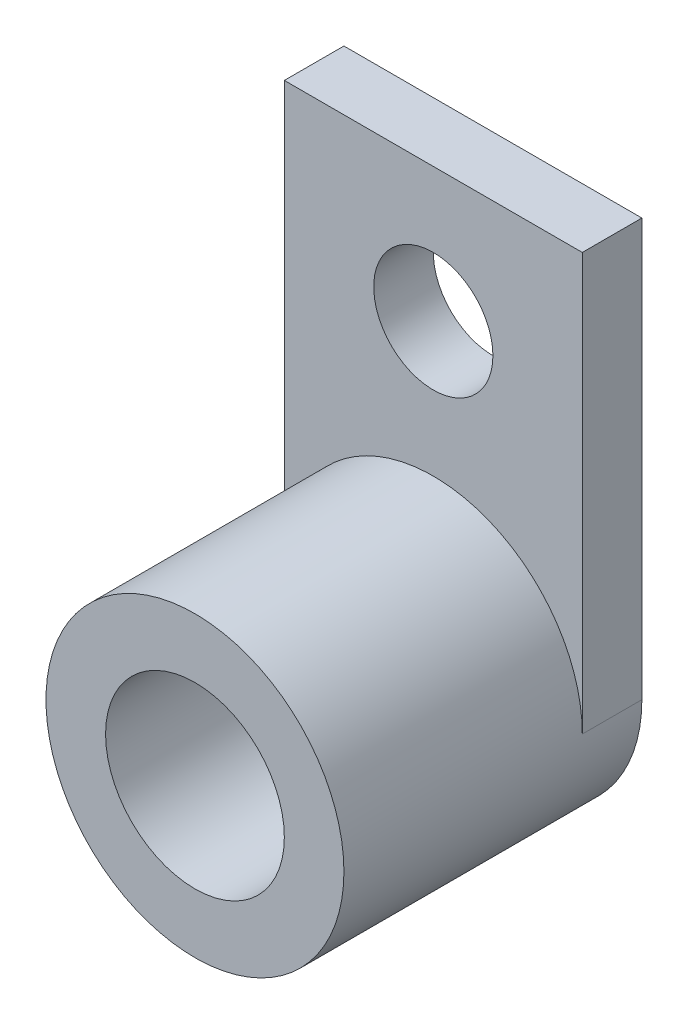
ISO-10303-21;
HEADER;
FILE_DESCRIPTION(('STEP AP214'),'2;1');
FILE_NAME('part.step','',(''),(''),'','','');
FILE_SCHEMA(('AUTOMOTIVE_DESIGN { 1 0 10303 214 1 1 1 1 }'));
ENDSEC;
DATA;
#1=APPLICATION_CONTEXT('core data for automotive mechanical design processes');
#2=APPLICATION_PROTOCOL_DEFINITION('international standard','automotive_design',2000,#1);
#3=PRODUCT_CONTEXT('',#1,'mechanical');
#4=PRODUCT('Part','Part','',(#3));
#5=PRODUCT_RELATED_PRODUCT_CATEGORY('part','',(#4));
#6=PRODUCT_DEFINITION_FORMATION('','',#4);
#7=PRODUCT_DEFINITION_CONTEXT('part definition',#1,'design');
#8=PRODUCT_DEFINITION('design','',#6,#7);
#9=PRODUCT_DEFINITION_SHAPE('','',#8);
#10=(LENGTH_UNIT() NAMED_UNIT(*) SI_UNIT(.MILLI.,.METRE.));
#11=(NAMED_UNIT(*) PLANE_ANGLE_UNIT() SI_UNIT($,.RADIAN.));
#12=(NAMED_UNIT(*) SI_UNIT($,.STERADIAN.) SOLID_ANGLE_UNIT());
#13=UNCERTAINTY_MEASURE_WITH_UNIT(LENGTH_MEASURE(1.E-05),#10,'distance_accuracy_value','');
#14=(GEOMETRIC_REPRESENTATION_CONTEXT(3) GLOBAL_UNCERTAINTY_ASSIGNED_CONTEXT((#13)) GLOBAL_UNIT_ASSIGNED_CONTEXT((#10,
#11,#12)) REPRESENTATION_CONTEXT('',''));
#15=CARTESIAN_POINT('',(0.,0.,0.));
#16=DIRECTION('',(0.,0.,1.));
#17=DIRECTION('',(1.,0.,0.));
#18=AXIS2_PLACEMENT_3D('',#15,#16,#17);
#19=CARTESIAN_POINT('',(0.,0.,127.));
#20=DIRECTION('',(0.,0.,1.));
#21=DIRECTION('',(1.,0.,0.));
#22=AXIS2_PLACEMENT_3D('',#19,#20,#21);
#23=PLANE('',#22);
#24=CARTESIAN_POINT('',(0.,0.,127.));
#25=DIRECTION('',(0.,0.,1.));
#26=DIRECTION('',(1.,0.,0.));
#27=AXIS2_PLACEMENT_3D('',#24,#25,#26);
#28=CIRCLE('',#27,63.5);
#29=CARTESIAN_POINT('',(63.5,0.,127.));
#30=VERTEX_POINT('',#29);
#31=EDGE_CURVE('E11',#30,#30,#28,.T.);
#32=ORIENTED_EDGE('',*,*,#31,.T.);
#33=EDGE_LOOP('',(#32));
#34=FACE_BOUND('',#33,.T.);
#35=CARTESIAN_POINT('',(0.,0.,127.));
#36=DIRECTION('',(0.,0.,1.));
#37=DIRECTION('',(1.,0.,0.));
#38=AXIS2_PLACEMENT_3D('',#35,#36,#37);
#39=CIRCLE('',#38,38.1);
#40=CARTESIAN_POINT('',(38.1,0.,127.));
#41=VERTEX_POINT('',#40);
#42=EDGE_CURVE('E134',#41,#41,#39,.T.);
#43=ORIENTED_EDGE('',*,*,#42,.F.);
#44=EDGE_LOOP('',(#43));
#45=FACE_BOUND('',#44,.T.);
#46=ADVANCED_FACE('F45',(#34,#45),#23,.T.);
#47=CARTESIAN_POINT('',(0.,0.,0.));
#48=DIRECTION('',(0.,0.,1.));
#49=DIRECTION('',(1.,0.,0.));
#50=AXIS2_PLACEMENT_3D('',#47,#48,#49);
#51=PLANE('',#50);
#52=CARTESIAN_POINT('',(0.,0.,0.));
#53=DIRECTION('',(0.,0.,1.));
#54=DIRECTION('',(1.,0.,0.));
#55=AXIS2_PLACEMENT_3D('',#52,#53,#54);
#56=CIRCLE('',#55,63.5);
#57=CARTESIAN_POINT('',(-63.5,0.,0.));
#58=VERTEX_POINT('',#57);
#59=CARTESIAN_POINT('',(63.5,0.,0.));
#60=VERTEX_POINT('',#59);
#61=EDGE_CURVE('E49',#58,#60,#56,.T.);
#62=ORIENTED_EDGE('',*,*,#61,.F.);
#63=DIRECTION('',(0.,-1.,0.));
#64=VECTOR('',#63,1.);
#65=CARTESIAN_POINT('',(-63.5,0.,0.));
#66=LINE('',#65,#64);
#67=CARTESIAN_POINT('',(-63.5,177.8,0.));
#68=VERTEX_POINT('',#67);
#69=EDGE_CURVE('E61',#68,#58,#66,.T.);
#70=ORIENTED_EDGE('',*,*,#69,.F.);
#71=DIRECTION('',(-1.,0.,0.));
#72=VECTOR('',#71,1.);
#73=CARTESIAN_POINT('',(-63.5,177.8,0.));
#74=LINE('',#73,#72);
#75=CARTESIAN_POINT('',(63.5,177.8,0.));
#76=VERTEX_POINT('',#75);
#77=EDGE_CURVE('E87',#76,#68,#74,.T.);
#78=ORIENTED_EDGE('',*,*,#77,.F.);
#79=DIRECTION('',(0.,1.,0.));
#80=VECTOR('',#79,1.);
#81=CARTESIAN_POINT('',(63.5,0.,0.));
#82=LINE('',#81,#80);
#83=EDGE_CURVE('E105',#60,#76,#82,.T.);
#84=ORIENTED_EDGE('',*,*,#83,.F.);
#85=EDGE_LOOP('',(#62,#70,#78,#84));
#86=FACE_BOUND('',#85,.T.);
#87=CARTESIAN_POINT('',(0.,0.,0.));
#88=DIRECTION('',(0.,0.,1.));
#89=DIRECTION('',(1.,0.,0.));
#90=AXIS2_PLACEMENT_3D('',#87,#88,#89);
#91=CIRCLE('',#90,38.1);
#92=CARTESIAN_POINT('',(38.1,0.,0.));
#93=VERTEX_POINT('',#92);
#94=EDGE_CURVE('E133',#93,#93,#91,.T.);
#95=ORIENTED_EDGE('',*,*,#94,.T.);
#96=EDGE_LOOP('',(#95));
#97=FACE_BOUND('',#96,.T.);
#98=CARTESIAN_POINT('',(0.,120.65,0.));
#99=DIRECTION('',(0.,0.,1.));
#100=DIRECTION('',(1.,0.,0.));
#101=AXIS2_PLACEMENT_3D('',#98,#99,#100);
#102=CIRCLE('',#101,25.4);
#103=CARTESIAN_POINT('',(25.4,120.65,0.));
#104=VERTEX_POINT('',#103);
#105=EDGE_CURVE('E239',#104,#104,#102,.T.);
#106=ORIENTED_EDGE('',*,*,#105,.T.);
#107=EDGE_LOOP('',(#106));
#108=FACE_BOUND('',#107,.T.);
#109=ADVANCED_FACE('F142',(#86,#97,#108),#51,.F.);
#110=CARTESIAN_POINT('',(0.,0.,127.));
#111=DIRECTION('',(0.,0.,-1.));
#112=DIRECTION('',(-1.,0.,0.));
#113=AXIS2_PLACEMENT_3D('',#110,#111,#112);
#114=CYLINDRICAL_SURFACE('',#113,63.5);
#115=ORIENTED_EDGE('',*,*,#31,.F.);
#116=EDGE_LOOP('',(#115));
#117=FACE_BOUND('',#116,.T.);
#118=CARTESIAN_POINT('',(0.,0.,25.4));
#119=DIRECTION('',(0.,0.,1.));
#120=DIRECTION('',(1.,0.,0.));
#121=AXIS2_PLACEMENT_3D('',#118,#119,#120);
#122=CIRCLE('',#121,63.5);
#123=CARTESIAN_POINT('',(63.5,0.,25.4));
#124=VERTEX_POINT('',#123);
#125=CARTESIAN_POINT('',(-63.5,0.,25.4));
#126=VERTEX_POINT('',#125);
#127=EDGE_CURVE('E91',#124,#126,#122,.T.);
#128=ORIENTED_EDGE('',*,*,#127,.T.);
#129=DIRECTION('',(0.,0.,-1.));
#130=VECTOR('',#129,1.);
#131=CARTESIAN_POINT('',(-63.5,0.,25.4));
#132=LINE('',#131,#130);
#133=EDGE_CURVE('E114',#126,#58,#132,.T.);
#134=ORIENTED_EDGE('',*,*,#133,.T.);
#135=ORIENTED_EDGE('',*,*,#61,.T.);
#136=DIRECTION('',(0.,0.,-1.));
#137=VECTOR('',#136,1.);
#138=CARTESIAN_POINT('',(63.5,0.,25.4));
#139=LINE('',#138,#137);
#140=EDGE_CURVE('E107',#124,#60,#139,.T.);
#141=ORIENTED_EDGE('',*,*,#140,.F.);
#142=EDGE_LOOP('',(#128,#134,#135,#141));
#143=FACE_BOUND('',#142,.T.);
#144=ADVANCED_FACE('F47',(#117,#143),#114,.T.);
#145=CARTESIAN_POINT('',(0.,0.,127.));
#146=DIRECTION('',(0.,0.,-1.));
#147=DIRECTION('',(-1.,0.,0.));
#148=AXIS2_PLACEMENT_3D('',#145,#146,#147);
#149=CYLINDRICAL_SURFACE('',#148,38.1);
#150=ORIENTED_EDGE('',*,*,#42,.T.);
#151=EDGE_LOOP('',(#150));
#152=FACE_BOUND('',#151,.T.);
#153=ORIENTED_EDGE('',*,*,#94,.F.);
#154=EDGE_LOOP('',(#153));
#155=FACE_BOUND('',#154,.T.);
#156=ADVANCED_FACE('F145',(#152,#155),#149,.F.);
#157=CARTESIAN_POINT('',(0.,0.,25.4));
#158=DIRECTION('',(0.,0.,1.));
#159=DIRECTION('',(1.,0.,0.));
#160=AXIS2_PLACEMENT_3D('',#157,#158,#159);
#161=PLANE('',#160);
#162=CARTESIAN_POINT('',(0.,120.65,25.4));
#163=DIRECTION('',(0.,0.,1.));
#164=DIRECTION('',(1.,0.,0.));
#165=AXIS2_PLACEMENT_3D('',#162,#163,#164);
#166=CIRCLE('',#165,25.4);
#167=CARTESIAN_POINT('',(25.4,120.65,25.4));
#168=VERTEX_POINT('',#167);
#169=EDGE_CURVE('E120',#168,#168,#166,.T.);
#170=ORIENTED_EDGE('',*,*,#169,.F.);
#171=EDGE_LOOP('',(#170));
#172=FACE_BOUND('',#171,.T.);
#173=ORIENTED_EDGE('',*,*,#127,.F.);
#174=DIRECTION('',(0.,1.,0.));
#175=VECTOR('',#174,1.);
#176=CARTESIAN_POINT('',(63.5,0.,25.4));
#177=LINE('',#176,#175);
#178=CARTESIAN_POINT('',(63.5,177.8,25.4));
#179=VERTEX_POINT('',#178);
#180=EDGE_CURVE('E93',#124,#179,#177,.T.);
#181=ORIENTED_EDGE('',*,*,#180,.T.);
#182=DIRECTION('',(-1.,0.,0.));
#183=VECTOR('',#182,1.);
#184=CARTESIAN_POINT('',(-63.5,177.8,25.4));
#185=LINE('',#184,#183);
#186=CARTESIAN_POINT('',(-63.5,177.8,25.4));
#187=VERTEX_POINT('',#186);
#188=EDGE_CURVE('E97',#179,#187,#185,.T.);
#189=ORIENTED_EDGE('',*,*,#188,.T.);
#190=DIRECTION('',(0.,-1.,0.));
#191=VECTOR('',#190,1.);
#192=CARTESIAN_POINT('',(-63.5,0.,25.4));
#193=LINE('',#192,#191);
#194=EDGE_CURVE('E70',#187,#126,#193,.T.);
#195=ORIENTED_EDGE('',*,*,#194,.T.);
#196=EDGE_LOOP('',(#173,#181,#189,#195));
#197=FACE_BOUND('',#196,.T.);
#198=ADVANCED_FACE('F95',(#172,#197),#161,.T.);
#199=CARTESIAN_POINT('',(63.5,0.,25.4));
#200=DIRECTION('',(-1.,0.,0.));
#201=DIRECTION('',(0.,-1.,0.));
#202=AXIS2_PLACEMENT_3D('',#199,#200,#201);
#203=PLANE('',#202);
#204=ORIENTED_EDGE('',*,*,#83,.T.);
#205=DIRECTION('',(0.,0.,-1.));
#206=VECTOR('',#205,1.);
#207=CARTESIAN_POINT('',(63.5,177.8,25.4));
#208=LINE('',#207,#206);
#209=EDGE_CURVE('E103',#179,#76,#208,.T.);
#210=ORIENTED_EDGE('',*,*,#209,.F.);
#211=ORIENTED_EDGE('',*,*,#180,.F.);
#212=ORIENTED_EDGE('',*,*,#140,.T.);
#213=EDGE_LOOP('',(#204,#210,#211,#212));
#214=FACE_BOUND('',#213,.T.);
#215=ADVANCED_FACE('F104',(#214),#203,.F.);
#216=CARTESIAN_POINT('',(-63.5,177.8,25.4));
#217=DIRECTION('',(0.,-1.,0.));
#218=DIRECTION('',(0.,0.,-1.));
#219=AXIS2_PLACEMENT_3D('',#216,#217,#218);
#220=PLANE('',#219);
#221=ORIENTED_EDGE('',*,*,#77,.T.);
#222=DIRECTION('',(0.,0.,-1.));
#223=VECTOR('',#222,1.);
#224=CARTESIAN_POINT('',(-63.5,177.8,25.4));
#225=LINE('',#224,#223);
#226=EDGE_CURVE('E108',#187,#68,#225,.T.);
#227=ORIENTED_EDGE('',*,*,#226,.F.);
#228=ORIENTED_EDGE('',*,*,#188,.F.);
#229=ORIENTED_EDGE('',*,*,#209,.T.);
#230=EDGE_LOOP('',(#221,#227,#228,#229));
#231=FACE_BOUND('',#230,.T.);
#232=ADVANCED_FACE('F110',(#231),#220,.F.);
#233=CARTESIAN_POINT('',(-63.5,0.,25.4));
#234=DIRECTION('',(1.,0.,0.));
#235=DIRECTION('',(0.,1.,0.));
#236=AXIS2_PLACEMENT_3D('',#233,#234,#235);
#237=PLANE('',#236);
#238=ORIENTED_EDGE('',*,*,#69,.T.);
#239=ORIENTED_EDGE('',*,*,#133,.F.);
#240=ORIENTED_EDGE('',*,*,#194,.F.);
#241=ORIENTED_EDGE('',*,*,#226,.T.);
#242=EDGE_LOOP('',(#238,#239,#240,#241));
#243=FACE_BOUND('',#242,.T.);
#244=ADVANCED_FACE('F171',(#243),#237,.F.);
#245=CARTESIAN_POINT('',(0.,120.65,25.4));
#246=DIRECTION('',(0.,0.,-1.));
#247=DIRECTION('',(-1.,0.,0.));
#248=AXIS2_PLACEMENT_3D('',#245,#246,#247);
#249=CYLINDRICAL_SURFACE('',#248,25.4);
#250=ORIENTED_EDGE('',*,*,#169,.T.);
#251=EDGE_LOOP('',(#250));
#252=FACE_BOUND('',#251,.T.);
#253=ORIENTED_EDGE('',*,*,#105,.F.);
#254=EDGE_LOOP('',(#253));
#255=FACE_BOUND('',#254,.T.);
#256=ADVANCED_FACE('F173',(#252,#255),#249,.F.);
#257=CLOSED_SHELL('',(#46,#109,#144,#156,#198,#215,#232,#244,#256));
#258=MANIFOLD_SOLID_BREP('B2',#257);
#259=ADVANCED_BREP_SHAPE_REPRESENTATION('',(#18,#258),#14);
#260=SHAPE_DEFINITION_REPRESENTATION(#9,#259);
ENDSEC;
END-ISO-10303-21;
